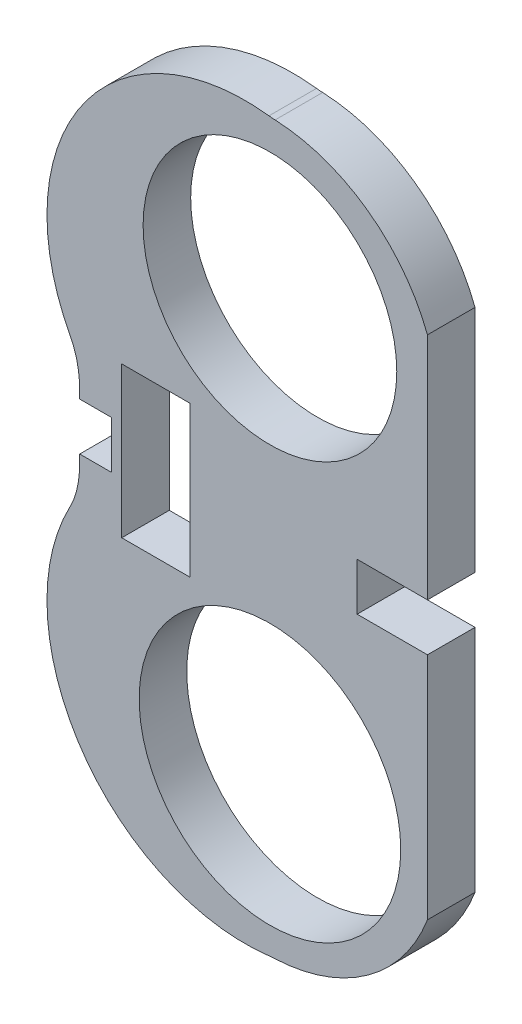
ISO-10303-21;
HEADER;
FILE_DESCRIPTION(('STEP AP214'),'2;1');
FILE_NAME('part.step','',(''),(''),'','','');
FILE_SCHEMA(('AUTOMOTIVE_DESIGN { 1 0 10303 214 1 1 1 1 }'));
ENDSEC;
DATA;
#1=APPLICATION_CONTEXT('core data for automotive mechanical design processes');
#2=APPLICATION_PROTOCOL_DEFINITION('international standard','automotive_design',2000,#1);
#3=PRODUCT_CONTEXT('',#1,'mechanical');
#4=PRODUCT('Part','Part','',(#3));
#5=PRODUCT_RELATED_PRODUCT_CATEGORY('part','',(#4));
#6=PRODUCT_DEFINITION_FORMATION('','',#4);
#7=PRODUCT_DEFINITION_CONTEXT('part definition',#1,'design');
#8=PRODUCT_DEFINITION('design','',#6,#7);
#9=PRODUCT_DEFINITION_SHAPE('','',#8);
#10=(LENGTH_UNIT() NAMED_UNIT(*) SI_UNIT(.MILLI.,.METRE.));
#11=(NAMED_UNIT(*) PLANE_ANGLE_UNIT() SI_UNIT($,.RADIAN.));
#12=(NAMED_UNIT(*) SI_UNIT($,.STERADIAN.) SOLID_ANGLE_UNIT());
#13=UNCERTAINTY_MEASURE_WITH_UNIT(LENGTH_MEASURE(1.E-05),#10,'distance_accuracy_value','');
#14=(GEOMETRIC_REPRESENTATION_CONTEXT(3) GLOBAL_UNCERTAINTY_ASSIGNED_CONTEXT((#13)) GLOBAL_UNIT_ASSIGNED_CONTEXT((#10,
#11,#12)) REPRESENTATION_CONTEXT('',''));
#15=CARTESIAN_POINT('',(0.,0.,0.));
#16=DIRECTION('',(0.,0.,1.));
#17=DIRECTION('',(1.,0.,0.));
#18=AXIS2_PLACEMENT_3D('',#15,#16,#17);
#19=CARTESIAN_POINT('',(-21.1200391898197,162.759908022731,3.));
#20=DIRECTION('',(0.,1.,0.));
#21=DIRECTION('',(0.,0.,1.));
#22=AXIS2_PLACEMENT_3D('',#19,#20,#21);
#23=PLANE('',#22);
#24=DIRECTION('',(1.,0.,0.));
#25=VECTOR('',#24,1.);
#26=CARTESIAN_POINT('',(-21.1200391898197,162.759908022731,0.));
#27=LINE('',#26,#25);
#28=CARTESIAN_POINT('',(-22.768228689794,162.759908022731,0.));
#29=VERTEX_POINT('',#28);
#30=CARTESIAN_POINT('',(-18.4718496898455,162.759908022731,0.));
#31=VERTEX_POINT('',#30);
#32=EDGE_CURVE('E54',#29,#31,#27,.T.);
#33=ORIENTED_EDGE('',*,*,#32,.F.);
#34=DIRECTION('',(0.,0.,-1.));
#35=VECTOR('',#34,1.);
#36=CARTESIAN_POINT('',(-22.768228689794,162.759908022731,3.));
#37=LINE('',#36,#35);
#38=CARTESIAN_POINT('',(-22.768228689794,162.759908022731,3.));
#39=VERTEX_POINT('',#38);
#40=EDGE_CURVE('E225',#39,#29,#37,.T.);
#41=ORIENTED_EDGE('',*,*,#40,.F.);
#42=DIRECTION('',(1.,0.,0.));
#43=VECTOR('',#42,1.);
#44=CARTESIAN_POINT('',(-21.1200391898197,162.759908022731,3.));
#45=LINE('',#44,#43);
#46=CARTESIAN_POINT('',(-18.4718496898455,162.759908022731,3.));
#47=VERTEX_POINT('',#46);
#48=EDGE_CURVE('E221',#39,#47,#45,.T.);
#49=ORIENTED_EDGE('',*,*,#48,.T.);
#50=DIRECTION('',(0.,0.,1.));
#51=VECTOR('',#50,1.);
#52=CARTESIAN_POINT('',(-18.4718496898455,162.759908022731,-7.));
#53=LINE('',#52,#51);
#54=EDGE_CURVE('E223',#31,#47,#53,.T.);
#55=ORIENTED_EDGE('',*,*,#54,.F.);
#56=EDGE_LOOP('',(#33,#41,#49,#55));
#57=FACE_BOUND('',#56,.T.);
#58=ADVANCED_FACE('F40',(#57),#23,.T.);
#59=CARTESIAN_POINT('',(-22.768228689794,167.509908022731,3.));
#60=DIRECTION('',(-1.,0.,0.));
#61=DIRECTION('',(0.,0.,1.));
#62=AXIS2_PLACEMENT_3D('',#59,#60,#61);
#63=PLANE('',#62);
#64=DIRECTION('',(0.,1.,0.));
#65=VECTOR('',#64,1.);
#66=CARTESIAN_POINT('',(-22.768228689794,167.509908022731,0.));
#67=LINE('',#66,#65);
#68=CARTESIAN_POINT('',(-22.768228689794,172.259908022731,0.));
#69=VERTEX_POINT('',#68);
#70=EDGE_CURVE('E374',#29,#69,#67,.T.);
#71=ORIENTED_EDGE('',*,*,#70,.T.);
#72=DIRECTION('',(0.,0.,-1.));
#73=VECTOR('',#72,1.);
#74=CARTESIAN_POINT('',(-22.768228689794,172.259908022731,3.));
#75=LINE('',#74,#73);
#76=CARTESIAN_POINT('',(-22.768228689794,172.259908022731,3.));
#77=VERTEX_POINT('',#76);
#78=EDGE_CURVE('E380',#77,#69,#75,.T.);
#79=ORIENTED_EDGE('',*,*,#78,.F.);
#80=DIRECTION('',(0.,1.,0.));
#81=VECTOR('',#80,1.);
#82=CARTESIAN_POINT('',(-22.768228689794,167.509908022731,3.));
#83=LINE('',#82,#81);
#84=EDGE_CURVE('E231',#39,#77,#83,.T.);
#85=ORIENTED_EDGE('',*,*,#84,.F.);
#86=ORIENTED_EDGE('',*,*,#40,.T.);
#87=EDGE_LOOP('',(#71,#79,#85,#86));
#88=FACE_BOUND('',#87,.T.);
#89=ADVANCED_FACE('F547',(#88),#63,.F.);
#90=CARTESIAN_POINT('',(-21.1200391898197,172.259908022731,3.));
#91=DIRECTION('',(0.,1.,0.));
#92=DIRECTION('',(0.,0.,1.));
#93=AXIS2_PLACEMENT_3D('',#90,#91,#92);
#94=PLANE('',#93);
#95=DIRECTION('',(1.,0.,0.));
#96=VECTOR('',#95,1.);
#97=CARTESIAN_POINT('',(-21.1200391898197,172.259908022731,0.));
#98=LINE('',#97,#96);
#99=CARTESIAN_POINT('',(-18.4718496898455,172.259908022731,0.));
#100=VERTEX_POINT('',#99);
#101=EDGE_CURVE('E265',#69,#100,#98,.T.);
#102=ORIENTED_EDGE('',*,*,#101,.T.);
#103=DIRECTION('',(0.,0.,1.));
#104=VECTOR('',#103,1.);
#105=CARTESIAN_POINT('',(-18.4718496898455,172.259908022731,-7.));
#106=LINE('',#105,#104);
#107=CARTESIAN_POINT('',(-18.4718496898455,172.259908022731,3.));
#108=VERTEX_POINT('',#107);
#109=EDGE_CURVE('E239',#100,#108,#106,.T.);
#110=ORIENTED_EDGE('',*,*,#109,.T.);
#111=DIRECTION('',(1.,0.,0.));
#112=VECTOR('',#111,1.);
#113=CARTESIAN_POINT('',(-21.1200391898197,172.259908022731,3.));
#114=LINE('',#113,#112);
#115=EDGE_CURVE('E243',#77,#108,#114,.T.);
#116=ORIENTED_EDGE('',*,*,#115,.F.);
#117=ORIENTED_EDGE('',*,*,#78,.T.);
#118=EDGE_LOOP('',(#102,#110,#116,#117));
#119=FACE_BOUND('',#118,.T.);
#120=ADVANCED_FACE('F553',(#119),#94,.F.);
#121=CARTESIAN_POINT('',(-14.9832009904694,156.975675467197,3.));
#122=DIRECTION('',(0.,0.,-1.));
#123=DIRECTION('',(-1.,0.,0.));
#124=AXIS2_PLACEMENT_3D('',#121,#122,#123);
#125=CYLINDRICAL_SURFACE('',#124,12.5);
#126=CARTESIAN_POINT('',(-14.9832009904694,156.975675467197,0.));
#127=DIRECTION('',(0.,0.,-1.));
#128=DIRECTION('',(1.,0.,0.));
#129=AXIS2_PLACEMENT_3D('',#126,#127,#128);
#130=CIRCLE('',#129,12.5);
#131=CARTESIAN_POINT('',(-13.4805260767824,144.566325439748,0.));
#132=VERTEX_POINT('',#131);
#133=CARTESIAN_POINT('',(-26.0326301848638,162.820340939068,0.));
#134=VERTEX_POINT('',#133);
#135=EDGE_CURVE('E259',#132,#134,#130,.T.);
#136=ORIENTED_EDGE('',*,*,#135,.F.);
#137=DIRECTION('',(0.,0.,-1.));
#138=VECTOR('',#137,1.);
#139=CARTESIAN_POINT('',(-13.4805260767824,144.566325439748,3.));
#140=LINE('',#139,#138);
#141=CARTESIAN_POINT('',(-13.4805260767824,144.566325439748,3.));
#142=VERTEX_POINT('',#141);
#143=EDGE_CURVE('E413',#132,#142,#140,.F.);
#144=ORIENTED_EDGE('',*,*,#143,.T.);
#145=CARTESIAN_POINT('',(-14.9832009904694,156.975675467197,3.));
#146=DIRECTION('',(0.,0.,-1.));
#147=DIRECTION('',(1.,0.,0.));
#148=AXIS2_PLACEMENT_3D('',#145,#146,#147);
#149=CIRCLE('',#148,12.5);
#150=CARTESIAN_POINT('',(-26.0326301848638,162.820340939068,3.));
#151=VERTEX_POINT('',#150);
#152=EDGE_CURVE('E260',#142,#151,#149,.T.);
#153=ORIENTED_EDGE('',*,*,#152,.T.);
#154=DIRECTION('',(0.,0.,-1.));
#155=VECTOR('',#154,1.);
#156=CARTESIAN_POINT('',(-26.0326301848638,162.820340939068,3.));
#157=LINE('',#156,#155);
#158=EDGE_CURVE('E409',#151,#134,#157,.T.);
#159=ORIENTED_EDGE('',*,*,#158,.T.);
#160=EDGE_LOOP('',(#136,#144,#153,#159));
#161=FACE_BOUND('',#160,.T.);
#162=ADVANCED_FACE('F493',(#161),#125,.T.);
#163=CARTESIAN_POINT('',(-13.5622671463433,155.372393663679,3.));
#164=DIRECTION('',(0.,0.,-1.));
#165=DIRECTION('',(-1.,0.,0.));
#166=AXIS2_PLACEMENT_3D('',#163,#164,#165);
#167=CYLINDRICAL_SURFACE('',#166,10.7845837029505);
#168=CARTESIAN_POINT('',(-13.5622671463433,155.372393663679,0.));
#169=DIRECTION('',(0.,0.,1.));
#170=DIRECTION('',(1.,0.,0.));
#171=AXIS2_PLACEMENT_3D('',#168,#169,#170);
#172=CIRCLE('',#171,10.7845837029505);
#173=CARTESIAN_POINT('',(-13.0957465906403,144.597905081057,0.));
#174=VERTEX_POINT('',#173);
#175=CARTESIAN_POINT('',(-3.48471778791434,151.531788949005,0.));
#176=VERTEX_POINT('',#175);
#177=EDGE_CURVE('E322',#174,#176,#172,.T.);
#178=ORIENTED_EDGE('',*,*,#177,.T.);
#179=DIRECTION('',(0.,0.,-1.));
#180=VECTOR('',#179,1.);
#181=CARTESIAN_POINT('',(-3.48471778791434,151.531788949005,3.));
#182=LINE('',#181,#180);
#183=CARTESIAN_POINT('',(-3.48471778791434,151.531788949005,3.));
#184=VERTEX_POINT('',#183);
#185=EDGE_CURVE('E253',#176,#184,#182,.F.);
#186=ORIENTED_EDGE('',*,*,#185,.T.);
#187=CARTESIAN_POINT('',(-13.5622671463433,155.372393663679,3.));
#188=DIRECTION('',(0.,0.,1.));
#189=DIRECTION('',(1.,0.,0.));
#190=AXIS2_PLACEMENT_3D('',#187,#188,#189);
#191=CIRCLE('',#190,10.7845837029505);
#192=CARTESIAN_POINT('',(-13.0957465906403,144.597905081057,3.));
#193=VERTEX_POINT('',#192);
#194=EDGE_CURVE('E264',#193,#184,#191,.T.);
#195=ORIENTED_EDGE('',*,*,#194,.F.);
#196=DIRECTION('',(0.,0.,-1.));
#197=VECTOR('',#196,1.);
#198=CARTESIAN_POINT('',(-13.0957465906403,144.597905081057,3.));
#199=LINE('',#198,#197);
#200=EDGE_CURVE('E387',#193,#174,#199,.T.);
#201=ORIENTED_EDGE('',*,*,#200,.T.);
#202=EDGE_LOOP('',(#178,#186,#195,#201));
#203=FACE_BOUND('',#202,.T.);
#204=ADVANCED_FACE('F487',(#203),#167,.T.);
#205=CARTESIAN_POINT('',(-5.60237848886703,166.009908022731,3.));
#206=DIRECTION('',(0.,1.,0.));
#207=DIRECTION('',(0.,0.,1.));
#208=AXIS2_PLACEMENT_3D('',#205,#206,#207);
#209=PLANE('',#208);
#210=DIRECTION('',(0.,0.,1.));
#211=VECTOR('',#210,1.);
#212=CARTESIAN_POINT('',(-3.48471778791434,166.009908022731,3.));
#213=LINE('',#212,#211);
#214=CARTESIAN_POINT('',(-3.48471778791434,166.009908022731,0.));
#215=VERTEX_POINT('',#214);
#216=CARTESIAN_POINT('',(-3.48471778791434,166.009908022731,3.));
#217=VERTEX_POINT('',#216);
#218=EDGE_CURVE('E251',#215,#217,#213,.T.);
#219=ORIENTED_EDGE('',*,*,#218,.F.);
#220=DIRECTION('',(1.,0.,0.));
#221=VECTOR('',#220,1.);
#222=CARTESIAN_POINT('',(-5.60237848886703,166.009908022731,0.));
#223=LINE('',#222,#221);
#224=CARTESIAN_POINT('',(-7.92003918981973,166.009908022731,0.));
#225=VERTEX_POINT('',#224);
#226=EDGE_CURVE('E326',#225,#215,#223,.T.);
#227=ORIENTED_EDGE('',*,*,#226,.F.);
#228=DIRECTION('',(0.,0.,-1.));
#229=VECTOR('',#228,1.);
#230=CARTESIAN_POINT('',(-7.92003918981973,166.009908022731,3.));
#231=LINE('',#230,#229);
#232=CARTESIAN_POINT('',(-7.92003918981973,166.009908022731,3.));
#233=VERTEX_POINT('',#232);
#234=EDGE_CURVE('E384',#233,#225,#231,.T.);
#235=ORIENTED_EDGE('',*,*,#234,.F.);
#236=DIRECTION('',(1.,0.,0.));
#237=VECTOR('',#236,1.);
#238=CARTESIAN_POINT('',(-5.60237848886703,166.009908022731,3.));
#239=LINE('',#238,#237);
#240=EDGE_CURVE('E269',#233,#217,#239,.T.);
#241=ORIENTED_EDGE('',*,*,#240,.T.);
#242=EDGE_LOOP('',(#219,#227,#235,#241));
#243=FACE_BOUND('',#242,.T.);
#244=ADVANCED_FACE('F475',(#243),#209,.T.);
#245=CARTESIAN_POINT('',(-7.92003918981973,166.759908022731,3.));
#246=DIRECTION('',(1.,0.,0.));
#247=DIRECTION('',(0.,0.,-1.));
#248=AXIS2_PLACEMENT_3D('',#245,#246,#247);
#249=PLANE('',#248);
#250=DIRECTION('',(0.,-1.,0.));
#251=VECTOR('',#250,1.);
#252=CARTESIAN_POINT('',(-7.92003918981973,166.759908022731,0.));
#253=LINE('',#252,#251);
#254=CARTESIAN_POINT('',(-7.92003918981973,169.009908022731,0.));
#255=VERTEX_POINT('',#254);
#256=EDGE_CURVE('E330',#255,#225,#253,.T.);
#257=ORIENTED_EDGE('',*,*,#256,.F.);
#258=DIRECTION('',(0.,0.,-1.));
#259=VECTOR('',#258,1.);
#260=CARTESIAN_POINT('',(-7.92003918981973,169.009908022731,3.));
#261=LINE('',#260,#259);
#262=CARTESIAN_POINT('',(-7.92003918981973,169.009908022731,3.));
#263=VERTEX_POINT('',#262);
#264=EDGE_CURVE('E401',#263,#255,#261,.T.);
#265=ORIENTED_EDGE('',*,*,#264,.F.);
#266=DIRECTION('',(0.,-1.,0.));
#267=VECTOR('',#266,1.);
#268=CARTESIAN_POINT('',(-7.92003918981973,166.759908022731,3.));
#269=LINE('',#268,#267);
#270=EDGE_CURVE('E273',#263,#233,#269,.T.);
#271=ORIENTED_EDGE('',*,*,#270,.T.);
#272=ORIENTED_EDGE('',*,*,#234,.T.);
#273=EDGE_LOOP('',(#257,#265,#271,#272));
#274=FACE_BOUND('',#273,.T.);
#275=ADVANCED_FACE('F471',(#274),#249,.T.);
#276=CARTESIAN_POINT('',(-5.60237848886703,169.009908022731,3.));
#277=DIRECTION('',(0.,1.,0.));
#278=DIRECTION('',(0.,0.,1.));
#279=AXIS2_PLACEMENT_3D('',#276,#277,#278);
#280=PLANE('',#279);
#281=DIRECTION('',(1.,0.,0.));
#282=VECTOR('',#281,1.);
#283=CARTESIAN_POINT('',(-5.60237848886703,169.009908022731,0.));
#284=LINE('',#283,#282);
#285=CARTESIAN_POINT('',(-3.48471778791434,169.009908022731,0.));
#286=VERTEX_POINT('',#285);
#287=EDGE_CURVE('E334',#255,#286,#284,.T.);
#288=ORIENTED_EDGE('',*,*,#287,.T.);
#289=DIRECTION('',(0.,0.,1.));
#290=VECTOR('',#289,1.);
#291=CARTESIAN_POINT('',(-3.48471778791434,169.009908022731,3.));
#292=LINE('',#291,#290);
#293=CARTESIAN_POINT('',(-3.48471778791434,169.009908022731,3.));
#294=VERTEX_POINT('',#293);
#295=EDGE_CURVE('E62',#286,#294,#292,.T.);
#296=ORIENTED_EDGE('',*,*,#295,.T.);
#297=DIRECTION('',(1.,0.,0.));
#298=VECTOR('',#297,1.);
#299=CARTESIAN_POINT('',(-5.60237848886703,169.009908022731,3.));
#300=LINE('',#299,#298);
#301=EDGE_CURVE('E277',#263,#294,#300,.T.);
#302=ORIENTED_EDGE('',*,*,#301,.F.);
#303=ORIENTED_EDGE('',*,*,#264,.T.);
#304=EDGE_LOOP('',(#288,#296,#302,#303));
#305=FACE_BOUND('',#304,.T.);
#306=ADVANCED_FACE('F467',(#305),#280,.F.);
#307=CARTESIAN_POINT('',(-13.5622671463433,179.647422381782,3.));
#308=DIRECTION('',(0.,0.,-1.));
#309=DIRECTION('',(-1.,0.,0.));
#310=AXIS2_PLACEMENT_3D('',#307,#308,#309);
#311=CYLINDRICAL_SURFACE('',#310,10.7845837029505);
#312=DIRECTION('',(0.,0.,-1.));
#313=VECTOR('',#312,1.);
#314=CARTESIAN_POINT('',(-3.48471778791434,183.488027096456,3.));
#315=LINE('',#314,#313);
#316=CARTESIAN_POINT('',(-3.48471778791434,183.488027096456,0.));
#317=VERTEX_POINT('',#316);
#318=CARTESIAN_POINT('',(-3.48471778791434,183.488027096456,3.));
#319=VERTEX_POINT('',#318);
#320=EDGE_CURVE('E256',#317,#319,#315,.F.);
#321=ORIENTED_EDGE('',*,*,#320,.F.);
#322=CARTESIAN_POINT('',(-13.5622671463433,179.647422381782,0.));
#323=DIRECTION('',(0.,0.,-1.));
#324=DIRECTION('',(1.,0.,0.));
#325=AXIS2_PLACEMENT_3D('',#322,#323,#324);
#326=CIRCLE('',#325,10.7845837029505);
#327=CARTESIAN_POINT('',(-13.0957465906402,190.421910964405,0.));
#328=VERTEX_POINT('',#327);
#329=EDGE_CURVE('E338',#328,#317,#326,.T.);
#330=ORIENTED_EDGE('',*,*,#329,.F.);
#331=DIRECTION('',(0.,0.,-1.));
#332=VECTOR('',#331,1.);
#333=CARTESIAN_POINT('',(-13.0957465906402,190.421910964405,3.));
#334=LINE('',#333,#332);
#335=CARTESIAN_POINT('',(-13.0957465906402,190.421910964405,3.));
#336=VERTEX_POINT('',#335);
#337=EDGE_CURVE('E423',#328,#336,#334,.F.);
#338=ORIENTED_EDGE('',*,*,#337,.T.);
#339=CARTESIAN_POINT('',(-13.5622671463433,179.647422381782,3.));
#340=DIRECTION('',(0.,0.,-1.));
#341=DIRECTION('',(1.,0.,0.));
#342=AXIS2_PLACEMENT_3D('',#339,#340,#341);
#343=CIRCLE('',#342,10.7845837029505);
#344=EDGE_CURVE('E281',#336,#319,#343,.T.);
#345=ORIENTED_EDGE('',*,*,#344,.T.);
#346=EDGE_LOOP('',(#321,#330,#338,#345));
#347=FACE_BOUND('',#346,.T.);
#348=ADVANCED_FACE('F536',(#347),#311,.T.);
#349=CARTESIAN_POINT('',(-14.9832009904694,178.044140578264,3.));
#350=DIRECTION('',(0.,0.,-1.));
#351=DIRECTION('',(-1.,0.,0.));
#352=AXIS2_PLACEMENT_3D('',#349,#350,#351);
#353=CYLINDRICAL_SURFACE('',#352,12.5);
#354=CARTESIAN_POINT('',(-14.9832009904694,178.044140578264,3.));
#355=DIRECTION('',(0.,0.,1.));
#356=DIRECTION('',(1.,0.,0.));
#357=AXIS2_PLACEMENT_3D('',#354,#355,#356);
#358=CIRCLE('',#357,12.5);
#359=CARTESIAN_POINT('',(-13.4805260767823,190.453490605714,3.));
#360=VERTEX_POINT('',#359);
#361=CARTESIAN_POINT('',(-26.0326301848638,172.199475106394,3.));
#362=VERTEX_POINT('',#361);
#363=EDGE_CURVE('E285',#360,#362,#358,.T.);
#364=ORIENTED_EDGE('',*,*,#363,.F.);
#365=DIRECTION('',(0.,0.,-1.));
#366=VECTOR('',#365,1.);
#367=CARTESIAN_POINT('',(-13.4805260767823,190.453490605714,3.));
#368=LINE('',#367,#366);
#369=CARTESIAN_POINT('',(-13.4805260767823,190.453490605714,0.));
#370=VERTEX_POINT('',#369);
#371=EDGE_CURVE('E419',#360,#370,#368,.T.);
#372=ORIENTED_EDGE('',*,*,#371,.T.);
#373=CARTESIAN_POINT('',(-14.9832009904694,178.044140578264,0.));
#374=DIRECTION('',(0.,0.,1.));
#375=DIRECTION('',(1.,0.,0.));
#376=AXIS2_PLACEMENT_3D('',#373,#374,#375);
#377=CIRCLE('',#376,12.5);
#378=CARTESIAN_POINT('',(-26.0326301848638,172.199475106394,0.));
#379=VERTEX_POINT('',#378);
#380=EDGE_CURVE('E342',#370,#379,#377,.T.);
#381=ORIENTED_EDGE('',*,*,#380,.T.);
#382=DIRECTION('',(0.,0.,-1.));
#383=VECTOR('',#382,1.);
#384=CARTESIAN_POINT('',(-26.0326301848638,172.199475106394,3.));
#385=LINE('',#384,#383);
#386=EDGE_CURVE('E416',#379,#362,#385,.F.);
#387=ORIENTED_EDGE('',*,*,#386,.T.);
#388=EDGE_LOOP('',(#364,#372,#381,#387));
#389=FACE_BOUND('',#388,.T.);
#390=ADVANCED_FACE('F528',(#389),#353,.T.);
#391=CARTESIAN_POINT('',(-34.2179105713668,169.325223967779,3.));
#392=DIRECTION('',(0.,0.,-1.));
#393=DIRECTION('',(-1.,0.,0.));
#394=AXIS2_PLACEMENT_3D('',#391,#392,#393);
#395=CYLINDRICAL_SURFACE('',#394,8.8035200341367);
#396=CARTESIAN_POINT('',(-34.2179105713668,169.325223967779,3.));
#397=DIRECTION('',(0.,0.,-1.));
#398=DIRECTION('',(1.,0.,0.));
#399=AXIS2_PLACEMENT_3D('',#396,#397,#398);
#400=CIRCLE('',#399,8.8035200341367);
#401=CARTESIAN_POINT('',(-25.502370477287,170.566725421639,3.));
#402=VERTEX_POINT('',#401);
#403=CARTESIAN_POINT('',(-25.4200391898198,169.009908022731,3.));
#404=VERTEX_POINT('',#403);
#405=EDGE_CURVE('E289',#402,#404,#400,.T.);
#406=ORIENTED_EDGE('',*,*,#405,.F.);
#407=DIRECTION('',(0.,0.,-1.));
#408=VECTOR('',#407,1.);
#409=CARTESIAN_POINT('',(-25.502370477287,170.566725421639,3.));
#410=LINE('',#409,#408);
#411=CARTESIAN_POINT('',(-25.502370477287,170.566725421639,0.));
#412=VERTEX_POINT('',#411);
#413=EDGE_CURVE('E426',#402,#412,#410,.T.);
#414=ORIENTED_EDGE('',*,*,#413,.T.);
#415=CARTESIAN_POINT('',(-34.2179105713668,169.325223967779,0.));
#416=DIRECTION('',(0.,0.,-1.));
#417=DIRECTION('',(1.,0.,0.));
#418=AXIS2_PLACEMENT_3D('',#415,#416,#417);
#419=CIRCLE('',#418,8.8035200341367);
#420=CARTESIAN_POINT('',(-25.4200391898198,169.009908022731,0.));
#421=VERTEX_POINT('',#420);
#422=EDGE_CURVE('E346',#412,#421,#419,.T.);
#423=ORIENTED_EDGE('',*,*,#422,.T.);
#424=DIRECTION('',(0.,0.,-1.));
#425=VECTOR('',#424,1.);
#426=CARTESIAN_POINT('',(-25.4200391898198,169.009908022731,3.));
#427=LINE('',#426,#425);
#428=EDGE_CURVE('E397',#404,#421,#427,.T.);
#429=ORIENTED_EDGE('',*,*,#428,.F.);
#430=EDGE_LOOP('',(#406,#414,#423,#429));
#431=FACE_BOUND('',#430,.T.);
#432=ADVANCED_FACE('F520',(#431),#395,.F.);
#433=CARTESIAN_POINT('',(-24.4200391898197,169.009908022731,3.));
#434=DIRECTION('',(0.,-1.,0.));
#435=DIRECTION('',(0.,0.,-1.));
#436=AXIS2_PLACEMENT_3D('',#433,#434,#435);
#437=PLANE('',#436);
#438=DIRECTION('',(-1.,0.,0.));
#439=VECTOR('',#438,1.);
#440=CARTESIAN_POINT('',(-24.4200391898197,169.009908022731,0.));
#441=LINE('',#440,#439);
#442=CARTESIAN_POINT('',(-23.4200391898198,169.009908022731,0.));
#443=VERTEX_POINT('',#442);
#444=EDGE_CURVE('E349',#443,#421,#441,.T.);
#445=ORIENTED_EDGE('',*,*,#444,.F.);
#446=DIRECTION('',(0.,0.,-1.));
#447=VECTOR('',#446,1.);
#448=CARTESIAN_POINT('',(-23.4200391898198,169.009908022731,3.));
#449=LINE('',#448,#447);
#450=CARTESIAN_POINT('',(-23.4200391898198,169.009908022731,3.));
#451=VERTEX_POINT('',#450);
#452=EDGE_CURVE('E394',#451,#443,#449,.T.);
#453=ORIENTED_EDGE('',*,*,#452,.F.);
#454=DIRECTION('',(-1.,0.,0.));
#455=VECTOR('',#454,1.);
#456=CARTESIAN_POINT('',(-24.4200391898197,169.009908022731,3.));
#457=LINE('',#456,#455);
#458=EDGE_CURVE('E292',#451,#404,#457,.T.);
#459=ORIENTED_EDGE('',*,*,#458,.T.);
#460=ORIENTED_EDGE('',*,*,#428,.T.);
#461=EDGE_LOOP('',(#445,#453,#459,#460));
#462=FACE_BOUND('',#461,.T.);
#463=ADVANCED_FACE('F514',(#462),#437,.T.);
#464=CARTESIAN_POINT('',(-23.4200391898198,168.259908022731,3.));
#465=DIRECTION('',(-1.,0.,0.));
#466=DIRECTION('',(0.,0.,1.));
#467=AXIS2_PLACEMENT_3D('',#464,#465,#466);
#468=PLANE('',#467);
#469=DIRECTION('',(0.,1.,0.));
#470=VECTOR('',#469,1.);
#471=CARTESIAN_POINT('',(-23.4200391898198,168.259908022731,0.));
#472=LINE('',#471,#470);
#473=CARTESIAN_POINT('',(-23.4200391898198,166.009908022731,0.));
#474=VERTEX_POINT('',#473);
#475=EDGE_CURVE('E353',#474,#443,#472,.T.);
#476=ORIENTED_EDGE('',*,*,#475,.F.);
#477=DIRECTION('',(0.,0.,-1.));
#478=VECTOR('',#477,1.);
#479=CARTESIAN_POINT('',(-23.4200391898198,166.009908022731,3.));
#480=LINE('',#479,#478);
#481=CARTESIAN_POINT('',(-23.4200391898198,166.009908022731,3.));
#482=VERTEX_POINT('',#481);
#483=EDGE_CURVE('E391',#482,#474,#480,.T.);
#484=ORIENTED_EDGE('',*,*,#483,.F.);
#485=DIRECTION('',(0.,1.,0.));
#486=VECTOR('',#485,1.);
#487=CARTESIAN_POINT('',(-23.4200391898198,168.259908022731,3.));
#488=LINE('',#487,#486);
#489=EDGE_CURVE('E296',#482,#451,#488,.T.);
#490=ORIENTED_EDGE('',*,*,#489,.T.);
#491=ORIENTED_EDGE('',*,*,#452,.T.);
#492=EDGE_LOOP('',(#476,#484,#490,#491));
#493=FACE_BOUND('',#492,.T.);
#494=ADVANCED_FACE('F509',(#493),#468,.T.);
#495=CARTESIAN_POINT('',(-24.4200391898197,166.009908022731,3.));
#496=DIRECTION('',(0.,-1.,0.));
#497=DIRECTION('',(0.,0.,-1.));
#498=AXIS2_PLACEMENT_3D('',#495,#496,#497);
#499=PLANE('',#498);
#500=DIRECTION('',(-1.,0.,0.));
#501=VECTOR('',#500,1.);
#502=CARTESIAN_POINT('',(-24.4200391898197,166.009908022731,0.));
#503=LINE('',#502,#501);
#504=CARTESIAN_POINT('',(-25.4200391898198,166.009908022731,0.));
#505=VERTEX_POINT('',#504);
#506=EDGE_CURVE('E357',#474,#505,#503,.T.);
#507=ORIENTED_EDGE('',*,*,#506,.T.);
#508=DIRECTION('',(0.,0.,-1.));
#509=VECTOR('',#508,1.);
#510=CARTESIAN_POINT('',(-25.4200391898198,166.009908022731,3.));
#511=LINE('',#510,#509);
#512=CARTESIAN_POINT('',(-25.4200391898198,166.009908022731,3.));
#513=VERTEX_POINT('',#512);
#514=EDGE_CURVE('E318',#513,#505,#511,.T.);
#515=ORIENTED_EDGE('',*,*,#514,.F.);
#516=DIRECTION('',(-1.,0.,0.));
#517=VECTOR('',#516,1.);
#518=CARTESIAN_POINT('',(-24.4200391898197,166.009908022731,3.));
#519=LINE('',#518,#517);
#520=EDGE_CURVE('E300',#482,#513,#519,.T.);
#521=ORIENTED_EDGE('',*,*,#520,.F.);
#522=ORIENTED_EDGE('',*,*,#483,.T.);
#523=EDGE_LOOP('',(#507,#515,#521,#522));
#524=FACE_BOUND('',#523,.T.);
#525=ADVANCED_FACE('F506',(#524),#499,.F.);
#526=CARTESIAN_POINT('',(-13.4200391898197,180.513390828321,3.));
#527=DIRECTION('',(0.,0.,-1.));
#528=DIRECTION('',(-1.,0.,0.));
#529=AXIS2_PLACEMENT_3D('',#526,#527,#528);
#530=CYLINDRICAL_SURFACE('',#529,8.);
#531=CARTESIAN_POINT('',(-13.4200391898197,180.513390828321,3.));
#532=DIRECTION('',(0.,0.,-1.));
#533=DIRECTION('',(1.,0.,0.));
#534=AXIS2_PLACEMENT_3D('',#531,#532,#533);
#535=CIRCLE('',#534,8.);
#536=CARTESIAN_POINT('',(-5.42003918981972,180.513390828321,3.));
#537=VERTEX_POINT('',#536);
#538=EDGE_CURVE('E232',#537,#537,#535,.T.);
#539=ORIENTED_EDGE('',*,*,#538,.F.);
#540=EDGE_LOOP('',(#539));
#541=FACE_BOUND('',#540,.T.);
#542=CARTESIAN_POINT('',(-13.4200391898197,180.513390828321,0.));
#543=DIRECTION('',(0.,0.,-1.));
#544=DIRECTION('',(1.,0.,0.));
#545=AXIS2_PLACEMENT_3D('',#542,#543,#544);
#546=CIRCLE('',#545,8.);
#547=CARTESIAN_POINT('',(-5.42003918981972,180.513390828321,0.));
#548=VERTEX_POINT('',#547);
#549=EDGE_CURVE('E368',#548,#548,#546,.T.);
#550=ORIENTED_EDGE('',*,*,#549,.T.);
#551=EDGE_LOOP('',(#550));
#552=FACE_BOUND('',#551,.T.);
#553=ADVANCED_FACE('F558',(#541,#552),#530,.F.);
#554=CARTESIAN_POINT('',(-13.4200391898197,154.513390828321,3.));
#555=DIRECTION('',(0.,0.,-1.));
#556=DIRECTION('',(-1.,0.,0.));
#557=AXIS2_PLACEMENT_3D('',#554,#555,#556);
#558=CYLINDRICAL_SURFACE('',#557,8.25);
#559=CARTESIAN_POINT('',(-13.4200391898197,154.513390828321,3.));
#560=DIRECTION('',(0.,0.,1.));
#561=DIRECTION('',(1.,0.,0.));
#562=AXIS2_PLACEMENT_3D('',#559,#560,#561);
#563=CIRCLE('',#562,8.25);
#564=CARTESIAN_POINT('',(-5.17003918981972,154.513390828321,3.));
#565=VERTEX_POINT('',#564);
#566=EDGE_CURVE('E307',#565,#565,#563,.T.);
#567=ORIENTED_EDGE('',*,*,#566,.T.);
#568=EDGE_LOOP('',(#567));
#569=FACE_BOUND('',#568,.T.);
#570=CARTESIAN_POINT('',(-13.4200391898197,154.513390828321,0.));
#571=DIRECTION('',(0.,0.,1.));
#572=DIRECTION('',(1.,0.,0.));
#573=AXIS2_PLACEMENT_3D('',#570,#571,#572);
#574=CIRCLE('',#573,8.25);
#575=CARTESIAN_POINT('',(-5.17003918981972,154.513390828321,0.));
#576=VERTEX_POINT('',#575);
#577=EDGE_CURVE('E364',#576,#576,#574,.T.);
#578=ORIENTED_EDGE('',*,*,#577,.F.);
#579=EDGE_LOOP('',(#578));
#580=FACE_BOUND('',#579,.T.);
#581=ADVANCED_FACE('F561',(#569,#580),#558,.F.);
#582=CARTESIAN_POINT('',(-34.2179105713665,165.694592077682,3.));
#583=DIRECTION('',(0.,0.,-1.));
#584=DIRECTION('',(-1.,0.,0.));
#585=AXIS2_PLACEMENT_3D('',#582,#583,#584);
#586=CYLINDRICAL_SURFACE('',#585,8.80352003413647);
#587=CARTESIAN_POINT('',(-34.2179105713665,165.694592077682,0.));
#588=DIRECTION('',(0.,0.,1.));
#589=DIRECTION('',(1.,0.,0.));
#590=AXIS2_PLACEMENT_3D('',#587,#588,#589);
#591=CIRCLE('',#590,8.80352003413647);
#592=CARTESIAN_POINT('',(-25.502370477287,164.453090623822,0.));
#593=VERTEX_POINT('',#592);
#594=EDGE_CURVE('E361',#593,#505,#591,.T.);
#595=ORIENTED_EDGE('',*,*,#594,.F.);
#596=DIRECTION('',(0.,0.,-1.));
#597=VECTOR('',#596,1.);
#598=CARTESIAN_POINT('',(-25.502370477287,164.453090623822,3.));
#599=LINE('',#598,#597);
#600=CARTESIAN_POINT('',(-25.502370477287,164.453090623822,3.));
#601=VERTEX_POINT('',#600);
#602=EDGE_CURVE('E430',#593,#601,#599,.F.);
#603=ORIENTED_EDGE('',*,*,#602,.T.);
#604=CARTESIAN_POINT('',(-34.2179105713665,165.694592077682,3.));
#605=DIRECTION('',(0.,0.,1.));
#606=DIRECTION('',(1.,0.,0.));
#607=AXIS2_PLACEMENT_3D('',#604,#605,#606);
#608=CIRCLE('',#607,8.80352003413647);
#609=EDGE_CURVE('E304',#601,#513,#608,.T.);
#610=ORIENTED_EDGE('',*,*,#609,.T.);
#611=ORIENTED_EDGE('',*,*,#514,.T.);
#612=EDGE_LOOP('',(#595,#603,#610,#611));
#613=FACE_BOUND('',#612,.T.);
#614=ADVANCED_FACE('F501',(#613),#586,.F.);
#615=CARTESIAN_POINT('',(221.883213984944,-32.3050135869362,3.));
#616=DIRECTION('',(0.,0.,1.));
#617=DIRECTION('',(1.,0.,0.));
#618=AXIS2_PLACEMENT_3D('',#615,#616,#617);
#619=PLANE('',#618);
#620=ORIENTED_EDGE('',*,*,#115,.T.);
#621=DIRECTION('',(0.,1.,0.));
#622=VECTOR('',#621,1.);
#623=CARTESIAN_POINT('',(-18.4718496898455,172.259908022731,3.));
#624=LINE('',#623,#622);
#625=EDGE_CURVE('E238',#47,#108,#624,.T.);
#626=ORIENTED_EDGE('',*,*,#625,.F.);
#627=ORIENTED_EDGE('',*,*,#48,.F.);
#628=ORIENTED_EDGE('',*,*,#84,.T.);
#629=EDGE_LOOP('',(#620,#626,#627,#628));
#630=FACE_BOUND('',#629,.T.);
#631=DIRECTION('',(0.,-1.,0.));
#632=VECTOR('',#631,1.);
#633=CARTESIAN_POINT('',(-3.48471778791434,147.060455890637,3.));
#634=LINE('',#633,#632);
#635=EDGE_CURVE('E250',#319,#294,#634,.T.);
#636=ORIENTED_EDGE('',*,*,#635,.F.);
#637=ORIENTED_EDGE('',*,*,#344,.F.);
#638=CARTESIAN_POINT('',(-12.8794561113075,195.417230616694,3.));
#639=DIRECTION('',(0.,0.,1.));
#640=DIRECTION('',(1.,0.,0.));
#641=AXIS2_PLACEMENT_3D('',#638,#639,#640);
#642=CIRCLE('',#641,5.);
#643=EDGE_CURVE('E442',#336,#360,#642,.F.);
#644=ORIENTED_EDGE('',*,*,#643,.T.);
#645=ORIENTED_EDGE('',*,*,#363,.T.);
#646=CARTESIAN_POINT('',(-30.4524018626217,169.861608917646,3.));
#647=DIRECTION('',(0.,0.,1.));
#648=DIRECTION('',(1.,0.,0.));
#649=AXIS2_PLACEMENT_3D('',#646,#647,#648);
#650=CIRCLE('',#649,5.);
#651=EDGE_CURVE('E448',#362,#402,#650,.F.);
#652=ORIENTED_EDGE('',*,*,#651,.T.);
#653=ORIENTED_EDGE('',*,*,#405,.T.);
#654=ORIENTED_EDGE('',*,*,#458,.F.);
#655=ORIENTED_EDGE('',*,*,#489,.F.);
#656=ORIENTED_EDGE('',*,*,#520,.T.);
#657=ORIENTED_EDGE('',*,*,#609,.F.);
#658=CARTESIAN_POINT('',(-30.4524018626217,165.158207127815,3.));
#659=DIRECTION('',(0.,0.,1.));
#660=DIRECTION('',(1.,0.,0.));
#661=AXIS2_PLACEMENT_3D('',#658,#659,#660);
#662=CIRCLE('',#661,5.);
#663=EDGE_CURVE('E454',#601,#151,#662,.F.);
#664=ORIENTED_EDGE('',*,*,#663,.T.);
#665=ORIENTED_EDGE('',*,*,#152,.F.);
#666=CARTESIAN_POINT('',(-12.8794561113076,139.602585428768,3.));
#667=DIRECTION('',(0.,0.,1.));
#668=DIRECTION('',(1.,0.,0.));
#669=AXIS2_PLACEMENT_3D('',#666,#667,#668);
#670=CIRCLE('',#669,5.);
#671=EDGE_CURVE('E436',#142,#193,#670,.F.);
#672=ORIENTED_EDGE('',*,*,#671,.T.);
#673=ORIENTED_EDGE('',*,*,#194,.T.);
#674=EDGE_CURVE('E247',#217,#184,#634,.T.);
#675=ORIENTED_EDGE('',*,*,#674,.F.);
#676=ORIENTED_EDGE('',*,*,#240,.F.);
#677=ORIENTED_EDGE('',*,*,#270,.F.);
#678=ORIENTED_EDGE('',*,*,#301,.T.);
#679=EDGE_LOOP('',(#636,#637,#644,#645,#652,#653,#654,#655,#656,#657,#664,#665,#672,#673,#675,
#676,#677,#678));
#680=FACE_BOUND('',#679,.T.);
#681=ORIENTED_EDGE('',*,*,#566,.F.);
#682=EDGE_LOOP('',(#681));
#683=FACE_BOUND('',#682,.T.);
#684=ORIENTED_EDGE('',*,*,#538,.T.);
#685=EDGE_LOOP('',(#684));
#686=FACE_BOUND('',#685,.T.);
#687=ADVANCED_FACE('F241',(#630,#680,#683,#686),#619,.T.);
#688=CARTESIAN_POINT('',(221.883213984944,-32.3050135869362,0.));
#689=DIRECTION('',(0.,0.,1.));
#690=DIRECTION('',(1.,0.,0.));
#691=AXIS2_PLACEMENT_3D('',#688,#689,#690);
#692=PLANE('',#691);
#693=ORIENTED_EDGE('',*,*,#329,.T.);
#694=DIRECTION('',(0.,-1.,0.));
#695=VECTOR('',#694,1.);
#696=CARTESIAN_POINT('',(-3.48471778791434,-32.3050135869362,0.));
#697=LINE('',#696,#695);
#698=EDGE_CURVE('E48',#317,#286,#697,.T.);
#699=ORIENTED_EDGE('',*,*,#698,.T.);
#700=ORIENTED_EDGE('',*,*,#287,.F.);
#701=ORIENTED_EDGE('',*,*,#256,.T.);
#702=ORIENTED_EDGE('',*,*,#226,.T.);
#703=EDGE_CURVE('E456',#215,#176,#697,.T.);
#704=ORIENTED_EDGE('',*,*,#703,.T.);
#705=ORIENTED_EDGE('',*,*,#177,.F.);
#706=CARTESIAN_POINT('',(-12.8794561113076,139.602585428768,0.));
#707=DIRECTION('',(0.,0.,1.));
#708=DIRECTION('',(1.,0.,0.));
#709=AXIS2_PLACEMENT_3D('',#706,#707,#708);
#710=CIRCLE('',#709,5.);
#711=EDGE_CURVE('E433',#174,#132,#710,.T.);
#712=ORIENTED_EDGE('',*,*,#711,.T.);
#713=ORIENTED_EDGE('',*,*,#135,.T.);
#714=CARTESIAN_POINT('',(-30.4524018626217,165.158207127815,0.));
#715=DIRECTION('',(0.,0.,1.));
#716=DIRECTION('',(1.,0.,0.));
#717=AXIS2_PLACEMENT_3D('',#714,#715,#716);
#718=CIRCLE('',#717,5.);
#719=EDGE_CURVE('E451',#134,#593,#718,.T.);
#720=ORIENTED_EDGE('',*,*,#719,.T.);
#721=ORIENTED_EDGE('',*,*,#594,.T.);
#722=ORIENTED_EDGE('',*,*,#506,.F.);
#723=ORIENTED_EDGE('',*,*,#475,.T.);
#724=ORIENTED_EDGE('',*,*,#444,.T.);
#725=ORIENTED_EDGE('',*,*,#422,.F.);
#726=CARTESIAN_POINT('',(-30.4524018626217,169.861608917646,0.));
#727=DIRECTION('',(0.,0.,1.));
#728=DIRECTION('',(1.,0.,0.));
#729=AXIS2_PLACEMENT_3D('',#726,#727,#728);
#730=CIRCLE('',#729,5.);
#731=EDGE_CURVE('E445',#412,#379,#730,.T.);
#732=ORIENTED_EDGE('',*,*,#731,.T.);
#733=ORIENTED_EDGE('',*,*,#380,.F.);
#734=CARTESIAN_POINT('',(-12.8794561113075,195.417230616694,0.));
#735=DIRECTION('',(0.,0.,1.));
#736=DIRECTION('',(1.,0.,0.));
#737=AXIS2_PLACEMENT_3D('',#734,#735,#736);
#738=CIRCLE('',#737,5.);
#739=EDGE_CURVE('E439',#370,#328,#738,.T.);
#740=ORIENTED_EDGE('',*,*,#739,.T.);
#741=EDGE_LOOP('',(#693,#699,#700,#701,#702,#704,#705,#712,#713,#720,#721,#722,#723,#724,#725,
#732,#733,#740));
#742=FACE_BOUND('',#741,.T.);
#743=ORIENTED_EDGE('',*,*,#577,.T.);
#744=EDGE_LOOP('',(#743));
#745=FACE_BOUND('',#744,.T.);
#746=ORIENTED_EDGE('',*,*,#549,.F.);
#747=EDGE_LOOP('',(#746));
#748=FACE_BOUND('',#747,.T.);
#749=DIRECTION('',(0.,1.,0.));
#750=VECTOR('',#749,1.);
#751=CARTESIAN_POINT('',(-18.4718496898455,-32.3050135869362,0.));
#752=LINE('',#751,#750);
#753=EDGE_CURVE('E11',#31,#100,#752,.T.);
#754=ORIENTED_EDGE('',*,*,#753,.T.);
#755=ORIENTED_EDGE('',*,*,#101,.F.);
#756=ORIENTED_EDGE('',*,*,#70,.F.);
#757=ORIENTED_EDGE('',*,*,#32,.T.);
#758=EDGE_LOOP('',(#754,#755,#756,#757));
#759=FACE_BOUND('',#758,.T.);
#760=ADVANCED_FACE('F461',(#742,#745,#748,#759),#692,.F.);
#761=CARTESIAN_POINT('',(-12.8794561113076,139.602585428768,3.));
#762=DIRECTION('',(0.,0.,1.));
#763=DIRECTION('',(1.,0.,0.));
#764=AXIS2_PLACEMENT_3D('',#761,#762,#763);
#765=CYLINDRICAL_SURFACE('',#764,5.);
#766=ORIENTED_EDGE('',*,*,#671,.F.);
#767=ORIENTED_EDGE('',*,*,#143,.F.);
#768=ORIENTED_EDGE('',*,*,#711,.F.);
#769=ORIENTED_EDGE('',*,*,#200,.F.);
#770=EDGE_LOOP('',(#766,#767,#768,#769));
#771=FACE_BOUND('',#770,.T.);
#772=ADVANCED_FACE('F489',(#771),#765,.F.);
#773=CARTESIAN_POINT('',(-12.8794561113075,195.417230616694,3.));
#774=DIRECTION('',(0.,0.,1.));
#775=DIRECTION('',(1.,0.,0.));
#776=AXIS2_PLACEMENT_3D('',#773,#774,#775);
#777=CYLINDRICAL_SURFACE('',#776,5.);
#778=ORIENTED_EDGE('',*,*,#643,.F.);
#779=ORIENTED_EDGE('',*,*,#337,.F.);
#780=ORIENTED_EDGE('',*,*,#739,.F.);
#781=ORIENTED_EDGE('',*,*,#371,.F.);
#782=EDGE_LOOP('',(#778,#779,#780,#781));
#783=FACE_BOUND('',#782,.T.);
#784=ADVANCED_FACE('F534',(#783),#777,.F.);
#785=CARTESIAN_POINT('',(-30.4524018626217,169.861608917646,3.));
#786=DIRECTION('',(0.,0.,-1.));
#787=DIRECTION('',(-1.,0.,0.));
#788=AXIS2_PLACEMENT_3D('',#785,#786,#787);
#789=CYLINDRICAL_SURFACE('',#788,5.);
#790=ORIENTED_EDGE('',*,*,#651,.F.);
#791=ORIENTED_EDGE('',*,*,#386,.F.);
#792=ORIENTED_EDGE('',*,*,#731,.F.);
#793=ORIENTED_EDGE('',*,*,#413,.F.);
#794=EDGE_LOOP('',(#790,#791,#792,#793));
#795=FACE_BOUND('',#794,.T.);
#796=ADVANCED_FACE('F524',(#795),#789,.F.);
#797=CARTESIAN_POINT('',(-30.4524018626217,165.158207127815,3.));
#798=DIRECTION('',(0.,0.,-1.));
#799=DIRECTION('',(-1.,0.,0.));
#800=AXIS2_PLACEMENT_3D('',#797,#798,#799);
#801=CYLINDRICAL_SURFACE('',#800,5.);
#802=ORIENTED_EDGE('',*,*,#663,.F.);
#803=ORIENTED_EDGE('',*,*,#602,.F.);
#804=ORIENTED_EDGE('',*,*,#719,.F.);
#805=ORIENTED_EDGE('',*,*,#158,.F.);
#806=EDGE_LOOP('',(#802,#803,#804,#805));
#807=FACE_BOUND('',#806,.T.);
#808=ADVANCED_FACE('F42',(#807),#801,.F.);
#809=CARTESIAN_POINT('',(-3.48471778791434,147.060455890637,-7.));
#810=DIRECTION('',(-1.,0.,0.));
#811=DIRECTION('',(0.,0.,1.));
#812=AXIS2_PLACEMENT_3D('',#809,#810,#811);
#813=PLANE('',#812);
#814=ORIENTED_EDGE('',*,*,#703,.F.);
#815=ORIENTED_EDGE('',*,*,#218,.T.);
#816=ORIENTED_EDGE('',*,*,#674,.T.);
#817=ORIENTED_EDGE('',*,*,#185,.F.);
#818=EDGE_LOOP('',(#814,#815,#816,#817));
#819=FACE_BOUND('',#818,.T.);
#820=ADVANCED_FACE('F479',(#819),#813,.F.);
#821=ORIENTED_EDGE('',*,*,#698,.F.);
#822=ORIENTED_EDGE('',*,*,#320,.T.);
#823=ORIENTED_EDGE('',*,*,#635,.T.);
#824=ORIENTED_EDGE('',*,*,#295,.F.);
#825=EDGE_LOOP('',(#821,#822,#823,#824));
#826=FACE_BOUND('',#825,.T.);
#827=ADVANCED_FACE('F537',(#826),#813,.F.);
#828=CARTESIAN_POINT('',(-18.4718496898455,172.259908022731,-7.));
#829=DIRECTION('',(1.,0.,0.));
#830=DIRECTION('',(0.,0.,-1.));
#831=AXIS2_PLACEMENT_3D('',#828,#829,#830);
#832=PLANE('',#831);
#833=ORIENTED_EDGE('',*,*,#54,.T.);
#834=ORIENTED_EDGE('',*,*,#625,.T.);
#835=ORIENTED_EDGE('',*,*,#109,.F.);
#836=ORIENTED_EDGE('',*,*,#753,.F.);
#837=EDGE_LOOP('',(#833,#834,#835,#836));
#838=FACE_BOUND('',#837,.T.);
#839=ADVANCED_FACE('F236',(#838),#832,.F.);
#840=CLOSED_SHELL('',(#58,#89,#120,#162,#204,#244,#275,#306,#348,#390,#432,#463,#494,#525,#553,
#581,#614,#687,#760,#772,#784,#796,#808,#820,#827,#839));
#841=MANIFOLD_SOLID_BREP('B2',#840);
#842=ADVANCED_BREP_SHAPE_REPRESENTATION('',(#18,#841),#14);
#843=SHAPE_DEFINITION_REPRESENTATION(#9,#842);
ENDSEC;
END-ISO-10303-21;
